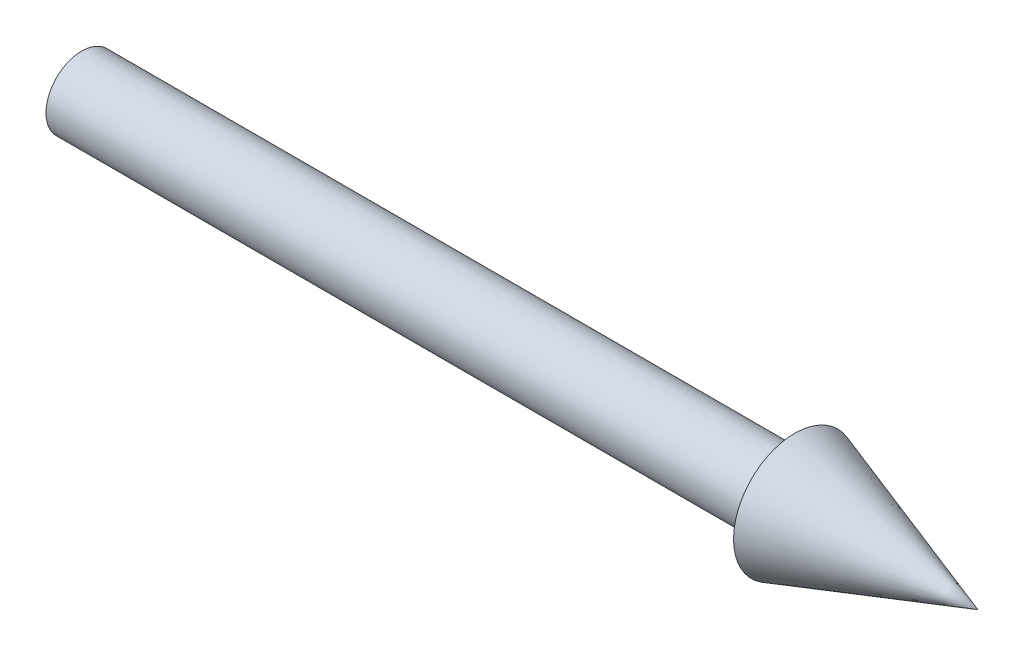
ISO-10303-21;
HEADER;
FILE_DESCRIPTION(('STEP AP214'),'2;1');
FILE_NAME('part.step','',(''),(''),'','','');
FILE_SCHEMA(('AUTOMOTIVE_DESIGN { 1 0 10303 214 1 1 1 1 }'));
ENDSEC;
DATA;
#1=APPLICATION_CONTEXT('core data for automotive mechanical design processes');
#2=APPLICATION_PROTOCOL_DEFINITION('international standard','automotive_design',2000,#1);
#3=PRODUCT_CONTEXT('',#1,'mechanical');
#4=PRODUCT('Part','Part','',(#3));
#5=PRODUCT_RELATED_PRODUCT_CATEGORY('part','',(#4));
#6=PRODUCT_DEFINITION_FORMATION('','',#4);
#7=PRODUCT_DEFINITION_CONTEXT('part definition',#1,'design');
#8=PRODUCT_DEFINITION('design','',#6,#7);
#9=PRODUCT_DEFINITION_SHAPE('','',#8);
#10=(LENGTH_UNIT() NAMED_UNIT(*) SI_UNIT(.MILLI.,.METRE.));
#11=(NAMED_UNIT(*) PLANE_ANGLE_UNIT() SI_UNIT($,.RADIAN.));
#12=(NAMED_UNIT(*) SI_UNIT($,.STERADIAN.) SOLID_ANGLE_UNIT());
#13=UNCERTAINTY_MEASURE_WITH_UNIT(LENGTH_MEASURE(1.E-05),#10,'distance_accuracy_value','');
#14=(GEOMETRIC_REPRESENTATION_CONTEXT(3) GLOBAL_UNCERTAINTY_ASSIGNED_CONTEXT((#13)) GLOBAL_UNIT_ASSIGNED_CONTEXT((#10,
#11,#12)) REPRESENTATION_CONTEXT('',''));
#15=CARTESIAN_POINT('',(0.,0.,0.));
#16=DIRECTION('',(0.,0.,1.));
#17=DIRECTION('',(1.,0.,0.));
#18=AXIS2_PLACEMENT_3D('',#15,#16,#17);
#19=CARTESIAN_POINT('',(0.,0.,0.));
#20=DIRECTION('',(-1.,0.,0.));
#21=DIRECTION('',(0.,0.,1.));
#22=AXIS2_PLACEMENT_3D('',#19,#20,#21);
#23=PLANE('',#22);
#24=CARTESIAN_POINT('',(0.,0.,0.));
#25=DIRECTION('',(-1.,0.,0.));
#26=DIRECTION('',(0.,0.,1.));
#27=AXIS2_PLACEMENT_3D('',#24,#25,#26);
#28=CIRCLE('',#27,3.5);
#29=CARTESIAN_POINT('',(0.,0.,3.5));
#30=VERTEX_POINT('',#29);
#31=EDGE_CURVE('E11',#30,#30,#28,.T.);
#32=ORIENTED_EDGE('',*,*,#31,.T.);
#33=EDGE_LOOP('',(#32));
#34=FACE_BOUND('',#33,.T.);
#35=ADVANCED_FACE('F41',(#34),#23,.T.);
#36=CARTESIAN_POINT('',(0.,0.,0.));
#37=DIRECTION('',(-1.,0.,0.));
#38=DIRECTION('',(0.,0.,1.));
#39=AXIS2_PLACEMENT_3D('',#36,#37,#38);
#40=CYLINDRICAL_SURFACE('',#39,3.5);
#41=CARTESIAN_POINT('',(70.,0.,0.));
#42=DIRECTION('',(-1.,0.,0.));
#43=DIRECTION('',(0.,0.,1.));
#44=AXIS2_PLACEMENT_3D('',#41,#42,#43);
#45=CIRCLE('',#44,3.5);
#46=CARTESIAN_POINT('',(70.,0.,3.5));
#47=VERTEX_POINT('',#46);
#48=EDGE_CURVE('E48',#47,#47,#45,.T.);
#49=ORIENTED_EDGE('',*,*,#48,.T.);
#50=EDGE_LOOP('',(#49));
#51=FACE_BOUND('',#50,.T.);
#52=ORIENTED_EDGE('',*,*,#31,.F.);
#53=EDGE_LOOP('',(#52));
#54=FACE_BOUND('',#53,.T.);
#55=ADVANCED_FACE('F66',(#51,#54),#40,.T.);
#56=CARTESIAN_POINT('',(70.,0.,3.5));
#57=DIRECTION('',(-1.,0.,0.));
#58=DIRECTION('',(0.,0.,1.));
#59=AXIS2_PLACEMENT_3D('',#56,#57,#58);
#60=PLANE('',#59);
#61=CARTESIAN_POINT('',(70.,0.,0.));
#62=DIRECTION('',(-1.,0.,0.));
#63=DIRECTION('',(0.,0.,1.));
#64=AXIS2_PLACEMENT_3D('',#61,#62,#63);
#65=CIRCLE('',#64,6.);
#66=CARTESIAN_POINT('',(70.,0.,6.));
#67=VERTEX_POINT('',#66);
#68=EDGE_CURVE('E58',#67,#67,#65,.T.);
#69=ORIENTED_EDGE('',*,*,#68,.T.);
#70=EDGE_LOOP('',(#69));
#71=FACE_BOUND('',#70,.T.);
#72=ORIENTED_EDGE('',*,*,#48,.F.);
#73=EDGE_LOOP('',(#72));
#74=FACE_BOUND('',#73,.T.);
#75=ADVANCED_FACE('F54',(#71,#74),#60,.T.);
#76=CARTESIAN_POINT('',(70.,0.,0.));
#77=DIRECTION('',(-1.,0.,0.));
#78=DIRECTION('',(0.,0.,1.));
#79=AXIS2_PLACEMENT_3D('',#76,#77,#78);
#80=CONICAL_SURFACE('',#79,6.,0.321750554396642);
#81=CARTESIAN_POINT('',(88.,0.,0.));
#82=VERTEX_POINT('',#81);
#83=VERTEX_LOOP('',#82);
#84=FACE_BOUND('',#83,.T.);
#85=ORIENTED_EDGE('',*,*,#68,.F.);
#86=EDGE_LOOP('',(#85));
#87=FACE_BOUND('',#86,.T.);
#88=ADVANCED_FACE('F51',(#84,#87),#80,.T.);
#89=CLOSED_SHELL('',(#35,#55,#75,#88));
#90=MANIFOLD_SOLID_BREP('B2',#89);
#91=ADVANCED_BREP_SHAPE_REPRESENTATION('',(#18,#90),#14);
#92=SHAPE_DEFINITION_REPRESENTATION(#9,#91);
ENDSEC;
END-ISO-10303-21;
